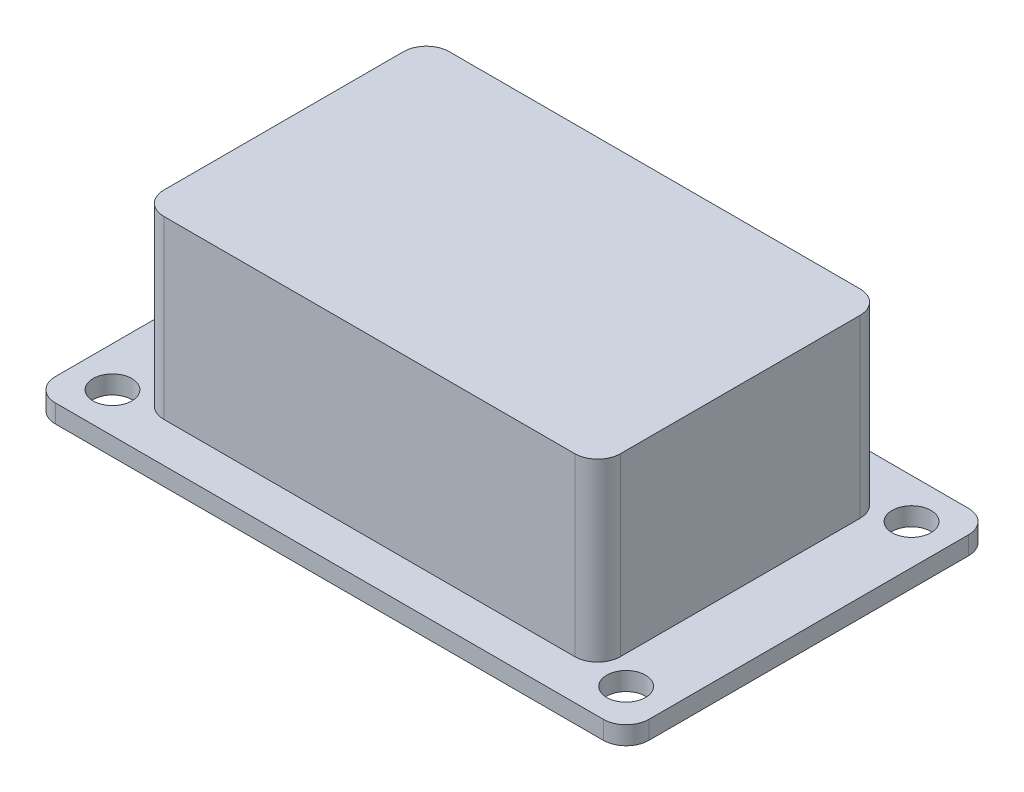
ISO-10303-21;
HEADER;
FILE_DESCRIPTION(('STEP AP214'),'2;1');
FILE_NAME('part.step','',(''),(''),'','','');
FILE_SCHEMA(('AUTOMOTIVE_DESIGN { 1 0 10303 214 1 1 1 1 }'));
ENDSEC;
DATA;
#1=APPLICATION_CONTEXT('core data for automotive mechanical design processes');
#2=APPLICATION_PROTOCOL_DEFINITION('international standard','automotive_design',2000,#1);
#3=PRODUCT_CONTEXT('',#1,'mechanical');
#4=PRODUCT('Part','Part','',(#3));
#5=PRODUCT_RELATED_PRODUCT_CATEGORY('part','',(#4));
#6=PRODUCT_DEFINITION_FORMATION('','',#4);
#7=PRODUCT_DEFINITION_CONTEXT('part definition',#1,'design');
#8=PRODUCT_DEFINITION('design','',#6,#7);
#9=PRODUCT_DEFINITION_SHAPE('','',#8);
#10=(LENGTH_UNIT() NAMED_UNIT(*) SI_UNIT(.MILLI.,.METRE.));
#11=(NAMED_UNIT(*) PLANE_ANGLE_UNIT() SI_UNIT($,.RADIAN.));
#12=(NAMED_UNIT(*) SI_UNIT($,.STERADIAN.) SOLID_ANGLE_UNIT());
#13=UNCERTAINTY_MEASURE_WITH_UNIT(LENGTH_MEASURE(1.E-05),#10,'distance_accuracy_value','');
#14=(GEOMETRIC_REPRESENTATION_CONTEXT(3) GLOBAL_UNCERTAINTY_ASSIGNED_CONTEXT((#13)) GLOBAL_UNIT_ASSIGNED_CONTEXT((#10,
#11,#12)) REPRESENTATION_CONTEXT('',''));
#15=CARTESIAN_POINT('',(0.,0.,0.));
#16=DIRECTION('',(0.,0.,1.));
#17=DIRECTION('',(1.,0.,0.));
#18=AXIS2_PLACEMENT_3D('',#15,#16,#17);
#19=CARTESIAN_POINT('',(-24.,1.6,14.));
#20=DIRECTION('',(0.,-1.,0.));
#21=DIRECTION('',(0.,0.,-1.));
#22=AXIS2_PLACEMENT_3D('',#19,#20,#21);
#23=CYLINDRICAL_SURFACE('',#22,2.);
#24=CARTESIAN_POINT('',(-24.,0.,14.));
#25=DIRECTION('',(0.,1.,0.));
#26=DIRECTION('',(0.,0.,1.));
#27=AXIS2_PLACEMENT_3D('',#24,#25,#26);
#28=CIRCLE('',#27,2.);
#29=CARTESIAN_POINT('',(-26.,0.,14.));
#30=VERTEX_POINT('',#29);
#31=CARTESIAN_POINT('',(-24.,0.,16.));
#32=VERTEX_POINT('',#31);
#33=EDGE_CURVE('E171',#30,#32,#28,.T.);
#34=ORIENTED_EDGE('',*,*,#33,.T.);
#35=DIRECTION('',(0.,-1.,0.));
#36=VECTOR('',#35,1.);
#37=CARTESIAN_POINT('',(-24.,1.6,16.));
#38=LINE('',#37,#36);
#39=CARTESIAN_POINT('',(-24.,1.6,16.));
#40=VERTEX_POINT('',#39);
#41=EDGE_CURVE('E11',#40,#32,#38,.T.);
#42=ORIENTED_EDGE('',*,*,#41,.F.);
#43=CARTESIAN_POINT('',(-24.,1.6,14.));
#44=DIRECTION('',(0.,1.,0.));
#45=DIRECTION('',(0.,0.,1.));
#46=AXIS2_PLACEMENT_3D('',#43,#44,#45);
#47=CIRCLE('',#46,2.);
#48=CARTESIAN_POINT('',(-26.,1.6,14.));
#49=VERTEX_POINT('',#48);
#50=EDGE_CURVE('E180',#49,#40,#47,.T.);
#51=ORIENTED_EDGE('',*,*,#50,.F.);
#52=DIRECTION('',(0.,-1.,0.));
#53=VECTOR('',#52,1.);
#54=CARTESIAN_POINT('',(-26.,1.6,14.));
#55=LINE('',#54,#53);
#56=EDGE_CURVE('E197',#49,#30,#55,.T.);
#57=ORIENTED_EDGE('',*,*,#56,.T.);
#58=EDGE_LOOP('',(#34,#42,#51,#57));
#59=FACE_BOUND('',#58,.T.);
#60=ADVANCED_FACE('F39',(#59),#23,.T.);
#61=CARTESIAN_POINT('',(-24.,1.6,16.));
#62=DIRECTION('',(0.,0.,-1.));
#63=DIRECTION('',(-1.,0.,0.));
#64=AXIS2_PLACEMENT_3D('',#61,#62,#63);
#65=PLANE('',#64);
#66=DIRECTION('',(1.,0.,0.));
#67=VECTOR('',#66,1.);
#68=CARTESIAN_POINT('',(-24.,0.,16.));
#69=LINE('',#68,#67);
#70=CARTESIAN_POINT('',(24.,0.,16.));
#71=VERTEX_POINT('',#70);
#72=EDGE_CURVE('E174',#32,#71,#69,.T.);
#73=ORIENTED_EDGE('',*,*,#72,.T.);
#74=DIRECTION('',(0.,-1.,0.));
#75=VECTOR('',#74,1.);
#76=CARTESIAN_POINT('',(24.,1.6,16.));
#77=LINE('',#76,#75);
#78=CARTESIAN_POINT('',(24.,1.6,16.));
#79=VERTEX_POINT('',#78);
#80=EDGE_CURVE('E46',#79,#71,#77,.T.);
#81=ORIENTED_EDGE('',*,*,#80,.F.);
#82=DIRECTION('',(1.,0.,0.));
#83=VECTOR('',#82,1.);
#84=CARTESIAN_POINT('',(-24.,1.6,16.));
#85=LINE('',#84,#83);
#86=EDGE_CURVE('E183',#40,#79,#85,.T.);
#87=ORIENTED_EDGE('',*,*,#86,.F.);
#88=ORIENTED_EDGE('',*,*,#41,.T.);
#89=EDGE_LOOP('',(#73,#81,#87,#88));
#90=FACE_BOUND('',#89,.T.);
#91=ADVANCED_FACE('F255',(#90),#65,.F.);
#92=CARTESIAN_POINT('',(24.,1.6,14.));
#93=DIRECTION('',(0.,-1.,0.));
#94=DIRECTION('',(0.,0.,-1.));
#95=AXIS2_PLACEMENT_3D('',#92,#93,#94);
#96=CYLINDRICAL_SURFACE('',#95,2.);
#97=CARTESIAN_POINT('',(24.,0.,14.));
#98=DIRECTION('',(0.,1.,0.));
#99=DIRECTION('',(0.,0.,1.));
#100=AXIS2_PLACEMENT_3D('',#97,#98,#99);
#101=CIRCLE('',#100,2.);
#102=CARTESIAN_POINT('',(26.,0.,14.));
#103=VERTEX_POINT('',#102);
#104=EDGE_CURVE('E200',#71,#103,#101,.T.);
#105=ORIENTED_EDGE('',*,*,#104,.T.);
#106=DIRECTION('',(0.,-1.,0.));
#107=VECTOR('',#106,1.);
#108=CARTESIAN_POINT('',(26.,1.6,14.));
#109=LINE('',#108,#107);
#110=CARTESIAN_POINT('',(26.,1.6,14.));
#111=VERTEX_POINT('',#110);
#112=EDGE_CURVE('E225',#111,#103,#109,.T.);
#113=ORIENTED_EDGE('',*,*,#112,.F.);
#114=CARTESIAN_POINT('',(24.,1.6,14.));
#115=DIRECTION('',(0.,1.,0.));
#116=DIRECTION('',(0.,0.,1.));
#117=AXIS2_PLACEMENT_3D('',#114,#115,#116);
#118=CIRCLE('',#117,2.);
#119=EDGE_CURVE('E186',#79,#111,#118,.T.);
#120=ORIENTED_EDGE('',*,*,#119,.F.);
#121=ORIENTED_EDGE('',*,*,#80,.T.);
#122=EDGE_LOOP('',(#105,#113,#120,#121));
#123=FACE_BOUND('',#122,.T.);
#124=ADVANCED_FACE('F232',(#123),#96,.T.);
#125=CARTESIAN_POINT('',(26.,1.6,14.));
#126=DIRECTION('',(-1.,0.,0.));
#127=DIRECTION('',(0.,0.,1.));
#128=AXIS2_PLACEMENT_3D('',#125,#126,#127);
#129=PLANE('',#128);
#130=DIRECTION('',(0.,0.,-1.));
#131=VECTOR('',#130,1.);
#132=CARTESIAN_POINT('',(26.,0.,14.));
#133=LINE('',#132,#131);
#134=CARTESIAN_POINT('',(26.,0.,-14.));
#135=VERTEX_POINT('',#134);
#136=EDGE_CURVE('E202',#103,#135,#133,.T.);
#137=ORIENTED_EDGE('',*,*,#136,.T.);
#138=DIRECTION('',(0.,-1.,0.));
#139=VECTOR('',#138,1.);
#140=CARTESIAN_POINT('',(26.,1.6,-14.));
#141=LINE('',#140,#139);
#142=CARTESIAN_POINT('',(26.,1.6,-14.));
#143=VERTEX_POINT('',#142);
#144=EDGE_CURVE('E222',#143,#135,#141,.T.);
#145=ORIENTED_EDGE('',*,*,#144,.F.);
#146=DIRECTION('',(0.,0.,-1.));
#147=VECTOR('',#146,1.);
#148=CARTESIAN_POINT('',(26.,1.6,14.));
#149=LINE('',#148,#147);
#150=EDGE_CURVE('E188',#111,#143,#149,.T.);
#151=ORIENTED_EDGE('',*,*,#150,.F.);
#152=ORIENTED_EDGE('',*,*,#112,.T.);
#153=EDGE_LOOP('',(#137,#145,#151,#152));
#154=FACE_BOUND('',#153,.T.);
#155=ADVANCED_FACE('F243',(#154),#129,.F.);
#156=CARTESIAN_POINT('',(24.,1.6,-14.));
#157=DIRECTION('',(0.,-1.,0.));
#158=DIRECTION('',(0.,0.,-1.));
#159=AXIS2_PLACEMENT_3D('',#156,#157,#158);
#160=CYLINDRICAL_SURFACE('',#159,2.);
#161=CARTESIAN_POINT('',(24.,0.,-14.));
#162=DIRECTION('',(0.,1.,0.));
#163=DIRECTION('',(0.,0.,1.));
#164=AXIS2_PLACEMENT_3D('',#161,#162,#163);
#165=CIRCLE('',#164,2.);
#166=CARTESIAN_POINT('',(24.,0.,-16.));
#167=VERTEX_POINT('',#166);
#168=EDGE_CURVE('E204',#135,#167,#165,.T.);
#169=ORIENTED_EDGE('',*,*,#168,.T.);
#170=DIRECTION('',(0.,-1.,0.));
#171=VECTOR('',#170,1.);
#172=CARTESIAN_POINT('',(24.,1.6,-16.));
#173=LINE('',#172,#171);
#174=CARTESIAN_POINT('',(24.,1.6,-16.));
#175=VERTEX_POINT('',#174);
#176=EDGE_CURVE('E219',#175,#167,#173,.T.);
#177=ORIENTED_EDGE('',*,*,#176,.F.);
#178=CARTESIAN_POINT('',(24.,1.6,-14.));
#179=DIRECTION('',(0.,1.,0.));
#180=DIRECTION('',(0.,0.,1.));
#181=AXIS2_PLACEMENT_3D('',#178,#179,#180);
#182=CIRCLE('',#181,2.);
#183=EDGE_CURVE('E190',#143,#175,#182,.T.);
#184=ORIENTED_EDGE('',*,*,#183,.F.);
#185=ORIENTED_EDGE('',*,*,#144,.T.);
#186=EDGE_LOOP('',(#169,#177,#184,#185));
#187=FACE_BOUND('',#186,.T.);
#188=ADVANCED_FACE('F247',(#187),#160,.T.);
#189=CARTESIAN_POINT('',(24.,1.6,-16.));
#190=DIRECTION('',(0.,0.,1.));
#191=DIRECTION('',(1.,0.,0.));
#192=AXIS2_PLACEMENT_3D('',#189,#190,#191);
#193=PLANE('',#192);
#194=DIRECTION('',(-1.,0.,0.));
#195=VECTOR('',#194,1.);
#196=CARTESIAN_POINT('',(24.,0.,-16.));
#197=LINE('',#196,#195);
#198=CARTESIAN_POINT('',(-24.,0.,-16.));
#199=VERTEX_POINT('',#198);
#200=EDGE_CURVE('E206',#167,#199,#197,.T.);
#201=ORIENTED_EDGE('',*,*,#200,.T.);
#202=DIRECTION('',(0.,-1.,0.));
#203=VECTOR('',#202,1.);
#204=CARTESIAN_POINT('',(-24.,1.6,-16.));
#205=LINE('',#204,#203);
#206=CARTESIAN_POINT('',(-24.,1.6,-16.));
#207=VERTEX_POINT('',#206);
#208=EDGE_CURVE('E216',#207,#199,#205,.T.);
#209=ORIENTED_EDGE('',*,*,#208,.F.);
#210=DIRECTION('',(-1.,0.,0.));
#211=VECTOR('',#210,1.);
#212=CARTESIAN_POINT('',(24.,1.6,-16.));
#213=LINE('',#212,#211);
#214=EDGE_CURVE('E192',#175,#207,#213,.T.);
#215=ORIENTED_EDGE('',*,*,#214,.F.);
#216=ORIENTED_EDGE('',*,*,#176,.T.);
#217=EDGE_LOOP('',(#201,#209,#215,#216));
#218=FACE_BOUND('',#217,.T.);
#219=ADVANCED_FACE('F268',(#218),#193,.F.);
#220=CARTESIAN_POINT('',(-24.,1.6,-14.));
#221=DIRECTION('',(0.,-1.,0.));
#222=DIRECTION('',(0.,0.,-1.));
#223=AXIS2_PLACEMENT_3D('',#220,#221,#222);
#224=CYLINDRICAL_SURFACE('',#223,2.);
#225=CARTESIAN_POINT('',(-24.,0.,-14.));
#226=DIRECTION('',(0.,1.,0.));
#227=DIRECTION('',(0.,0.,1.));
#228=AXIS2_PLACEMENT_3D('',#225,#226,#227);
#229=CIRCLE('',#228,2.);
#230=CARTESIAN_POINT('',(-26.,0.,-14.));
#231=VERTEX_POINT('',#230);
#232=EDGE_CURVE('E208',#199,#231,#229,.T.);
#233=ORIENTED_EDGE('',*,*,#232,.T.);
#234=DIRECTION('',(0.,-1.,0.));
#235=VECTOR('',#234,1.);
#236=CARTESIAN_POINT('',(-26.,1.6,-14.));
#237=LINE('',#236,#235);
#238=CARTESIAN_POINT('',(-26.,1.6,-14.));
#239=VERTEX_POINT('',#238);
#240=EDGE_CURVE('E213',#239,#231,#237,.T.);
#241=ORIENTED_EDGE('',*,*,#240,.F.);
#242=CARTESIAN_POINT('',(-24.,1.6,-14.));
#243=DIRECTION('',(0.,1.,0.));
#244=DIRECTION('',(0.,0.,1.));
#245=AXIS2_PLACEMENT_3D('',#242,#243,#244);
#246=CIRCLE('',#245,2.);
#247=EDGE_CURVE('E194',#207,#239,#246,.T.);
#248=ORIENTED_EDGE('',*,*,#247,.F.);
#249=ORIENTED_EDGE('',*,*,#208,.T.);
#250=EDGE_LOOP('',(#233,#241,#248,#249));
#251=FACE_BOUND('',#250,.T.);
#252=ADVANCED_FACE('F266',(#251),#224,.T.);
#253=CARTESIAN_POINT('',(-26.,1.6,-14.));
#254=DIRECTION('',(1.,0.,0.));
#255=DIRECTION('',(0.,0.,-1.));
#256=AXIS2_PLACEMENT_3D('',#253,#254,#255);
#257=PLANE('',#256);
#258=DIRECTION('',(0.,0.,1.));
#259=VECTOR('',#258,1.);
#260=CARTESIAN_POINT('',(-26.,0.,-14.));
#261=LINE('',#260,#259);
#262=EDGE_CURVE('E184',#231,#30,#261,.T.);
#263=ORIENTED_EDGE('',*,*,#262,.T.);
#264=ORIENTED_EDGE('',*,*,#56,.F.);
#265=DIRECTION('',(0.,0.,1.));
#266=VECTOR('',#265,1.);
#267=CARTESIAN_POINT('',(-26.,1.6,-14.));
#268=LINE('',#267,#266);
#269=EDGE_CURVE('E196',#239,#49,#268,.T.);
#270=ORIENTED_EDGE('',*,*,#269,.F.);
#271=ORIENTED_EDGE('',*,*,#240,.T.);
#272=EDGE_LOOP('',(#263,#264,#270,#271));
#273=FACE_BOUND('',#272,.T.);
#274=ADVANCED_FACE('F261',(#273),#257,.F.);
#275=CARTESIAN_POINT('',(-24.,1.6,14.));
#276=DIRECTION('',(0.,1.,0.));
#277=DIRECTION('',(0.,0.,1.));
#278=AXIS2_PLACEMENT_3D('',#275,#276,#277);
#279=PLANE('',#278);
#280=CARTESIAN_POINT('',(22.5,1.6,-12.5));
#281=DIRECTION('',(0.,1.,0.));
#282=DIRECTION('',(0.,0.,1.));
#283=AXIS2_PLACEMENT_3D('',#280,#281,#282);
#284=CIRCLE('',#283,1.7);
#285=CARTESIAN_POINT('',(22.5,1.6,-10.8));
#286=VERTEX_POINT('',#285);
#287=EDGE_CURVE('E463',#286,#286,#284,.T.);
#288=ORIENTED_EDGE('',*,*,#287,.F.);
#289=EDGE_LOOP('',(#288));
#290=FACE_BOUND('',#289,.T.);
#291=CARTESIAN_POINT('',(-22.5,1.6,12.5));
#292=DIRECTION('',(0.,1.,0.));
#293=DIRECTION('',(0.,0.,1.));
#294=AXIS2_PLACEMENT_3D('',#291,#292,#293);
#295=CIRCLE('',#294,1.7);
#296=CARTESIAN_POINT('',(-22.5,1.6,14.2));
#297=VERTEX_POINT('',#296);
#298=EDGE_CURVE('E480',#297,#297,#295,.T.);
#299=ORIENTED_EDGE('',*,*,#298,.F.);
#300=EDGE_LOOP('',(#299));
#301=FACE_BOUND('',#300,.T.);
#302=CARTESIAN_POINT('',(-22.5,1.6,-12.5));
#303=DIRECTION('',(0.,1.,0.));
#304=DIRECTION('',(0.,0.,1.));
#305=AXIS2_PLACEMENT_3D('',#302,#303,#304);
#306=CIRCLE('',#305,1.7);
#307=CARTESIAN_POINT('',(-22.5,1.6,-10.8));
#308=VERTEX_POINT('',#307);
#309=EDGE_CURVE('E475',#308,#308,#306,.T.);
#310=ORIENTED_EDGE('',*,*,#309,.F.);
#311=EDGE_LOOP('',(#310));
#312=FACE_BOUND('',#311,.T.);
#313=CARTESIAN_POINT('',(22.5,1.6,12.5));
#314=DIRECTION('',(0.,1.,0.));
#315=DIRECTION('',(0.,0.,1.));
#316=AXIS2_PLACEMENT_3D('',#313,#314,#315);
#317=CIRCLE('',#316,1.7);
#318=CARTESIAN_POINT('',(22.5,1.6,14.2));
#319=VERTEX_POINT('',#318);
#320=EDGE_CURVE('E470',#319,#319,#317,.T.);
#321=ORIENTED_EDGE('',*,*,#320,.F.);
#322=EDGE_LOOP('',(#321));
#323=FACE_BOUND('',#322,.T.);
#324=CARTESIAN_POINT('',(-18.,1.6,10.5));
#325=DIRECTION('',(0.,1.,0.));
#326=DIRECTION('',(0.,0.,1.));
#327=AXIS2_PLACEMENT_3D('',#324,#325,#326);
#328=CIRCLE('',#327,2.);
#329=CARTESIAN_POINT('',(-20.,1.6,10.5));
#330=VERTEX_POINT('',#329);
#331=CARTESIAN_POINT('',(-18.,1.6,12.5));
#332=VERTEX_POINT('',#331);
#333=EDGE_CURVE('E53',#330,#332,#328,.T.);
#334=ORIENTED_EDGE('',*,*,#333,.F.);
#335=DIRECTION('',(0.,0.,1.));
#336=VECTOR('',#335,1.);
#337=CARTESIAN_POINT('',(-20.,1.6,-10.5));
#338=LINE('',#337,#336);
#339=CARTESIAN_POINT('',(-20.,1.6,-10.5));
#340=VERTEX_POINT('',#339);
#341=EDGE_CURVE('E57',#340,#330,#338,.T.);
#342=ORIENTED_EDGE('',*,*,#341,.F.);
#343=CARTESIAN_POINT('',(-18.,1.6,-10.5));
#344=DIRECTION('',(0.,1.,0.));
#345=DIRECTION('',(0.,0.,1.));
#346=AXIS2_PLACEMENT_3D('',#343,#344,#345);
#347=CIRCLE('',#346,2.);
#348=CARTESIAN_POINT('',(-18.,1.6,-12.5));
#349=VERTEX_POINT('',#348);
#350=EDGE_CURVE('E512',#349,#340,#347,.T.);
#351=ORIENTED_EDGE('',*,*,#350,.F.);
#352=DIRECTION('',(-1.,0.,0.));
#353=VECTOR('',#352,1.);
#354=CARTESIAN_POINT('',(18.,1.6,-12.5));
#355=LINE('',#354,#353);
#356=CARTESIAN_POINT('',(18.,1.6,-12.5));
#357=VERTEX_POINT('',#356);
#358=EDGE_CURVE('E509',#357,#349,#355,.T.);
#359=ORIENTED_EDGE('',*,*,#358,.F.);
#360=CARTESIAN_POINT('',(18.,1.6,-10.5));
#361=DIRECTION('',(0.,1.,0.));
#362=DIRECTION('',(0.,0.,1.));
#363=AXIS2_PLACEMENT_3D('',#360,#361,#362);
#364=CIRCLE('',#363,2.);
#365=CARTESIAN_POINT('',(20.,1.6,-10.5));
#366=VERTEX_POINT('',#365);
#367=EDGE_CURVE('E506',#366,#357,#364,.T.);
#368=ORIENTED_EDGE('',*,*,#367,.F.);
#369=DIRECTION('',(0.,0.,-1.));
#370=VECTOR('',#369,1.);
#371=CARTESIAN_POINT('',(20.,1.6,10.5));
#372=LINE('',#371,#370);
#373=CARTESIAN_POINT('',(20.,1.6,10.5));
#374=VERTEX_POINT('',#373);
#375=EDGE_CURVE('E503',#374,#366,#372,.T.);
#376=ORIENTED_EDGE('',*,*,#375,.F.);
#377=CARTESIAN_POINT('',(18.,1.6,10.5));
#378=DIRECTION('',(0.,1.,0.));
#379=DIRECTION('',(0.,0.,1.));
#380=AXIS2_PLACEMENT_3D('',#377,#378,#379);
#381=CIRCLE('',#380,2.);
#382=CARTESIAN_POINT('',(18.,1.6,12.5));
#383=VERTEX_POINT('',#382);
#384=EDGE_CURVE('E500',#383,#374,#381,.T.);
#385=ORIENTED_EDGE('',*,*,#384,.F.);
#386=DIRECTION('',(1.,0.,0.));
#387=VECTOR('',#386,1.);
#388=CARTESIAN_POINT('',(-18.,1.6,12.5));
#389=LINE('',#388,#387);
#390=EDGE_CURVE('E498',#332,#383,#389,.T.);
#391=ORIENTED_EDGE('',*,*,#390,.F.);
#392=EDGE_LOOP('',(#334,#342,#351,#359,#368,#376,#385,#391));
#393=FACE_BOUND('',#392,.T.);
#394=ORIENTED_EDGE('',*,*,#50,.T.);
#395=ORIENTED_EDGE('',*,*,#86,.T.);
#396=ORIENTED_EDGE('',*,*,#119,.T.);
#397=ORIENTED_EDGE('',*,*,#150,.T.);
#398=ORIENTED_EDGE('',*,*,#183,.T.);
#399=ORIENTED_EDGE('',*,*,#214,.T.);
#400=ORIENTED_EDGE('',*,*,#247,.T.);
#401=ORIENTED_EDGE('',*,*,#269,.T.);
#402=EDGE_LOOP('',(#394,#395,#396,#397,#398,#399,#400,#401));
#403=FACE_BOUND('',#402,.T.);
#404=ADVANCED_FACE('F251',(#290,#301,#312,#323,#393,#403),#279,.T.);
#405=CARTESIAN_POINT('',(-24.,0.,14.));
#406=DIRECTION('',(0.,1.,0.));
#407=DIRECTION('',(0.,0.,1.));
#408=AXIS2_PLACEMENT_3D('',#405,#406,#407);
#409=PLANE('',#408);
#410=CARTESIAN_POINT('',(22.5,0.,-12.5));
#411=DIRECTION('',(0.,1.,0.));
#412=DIRECTION('',(0.,0.,1.));
#413=AXIS2_PLACEMENT_3D('',#410,#411,#412);
#414=CIRCLE('',#413,1.7);
#415=CARTESIAN_POINT('',(22.5,0.,-10.8));
#416=VERTEX_POINT('',#415);
#417=EDGE_CURVE('E466',#416,#416,#414,.T.);
#418=ORIENTED_EDGE('',*,*,#417,.T.);
#419=EDGE_LOOP('',(#418));
#420=FACE_BOUND('',#419,.T.);
#421=CARTESIAN_POINT('',(-22.5,0.,12.5));
#422=DIRECTION('',(0.,1.,0.));
#423=DIRECTION('',(0.,0.,1.));
#424=AXIS2_PLACEMENT_3D('',#421,#422,#423);
#425=CIRCLE('',#424,1.7);
#426=CARTESIAN_POINT('',(-22.5,0.,14.2));
#427=VERTEX_POINT('',#426);
#428=EDGE_CURVE('E472',#427,#427,#425,.T.);
#429=ORIENTED_EDGE('',*,*,#428,.T.);
#430=EDGE_LOOP('',(#429));
#431=FACE_BOUND('',#430,.T.);
#432=CARTESIAN_POINT('',(-22.5,0.,-12.5));
#433=DIRECTION('',(0.,1.,0.));
#434=DIRECTION('',(0.,0.,1.));
#435=AXIS2_PLACEMENT_3D('',#432,#433,#434);
#436=CIRCLE('',#435,1.7);
#437=CARTESIAN_POINT('',(-22.5,0.,-10.8));
#438=VERTEX_POINT('',#437);
#439=EDGE_CURVE('E483',#438,#438,#436,.T.);
#440=ORIENTED_EDGE('',*,*,#439,.T.);
#441=EDGE_LOOP('',(#440));
#442=FACE_BOUND('',#441,.T.);
#443=CARTESIAN_POINT('',(22.5,0.,12.5));
#444=DIRECTION('',(0.,1.,0.));
#445=DIRECTION('',(0.,0.,1.));
#446=AXIS2_PLACEMENT_3D('',#443,#444,#445);
#447=CIRCLE('',#446,1.7);
#448=CARTESIAN_POINT('',(22.5,0.,14.2));
#449=VERTEX_POINT('',#448);
#450=EDGE_CURVE('E467',#449,#449,#447,.T.);
#451=ORIENTED_EDGE('',*,*,#450,.T.);
#452=EDGE_LOOP('',(#451));
#453=FACE_BOUND('',#452,.T.);
#454=ORIENTED_EDGE('',*,*,#33,.F.);
#455=ORIENTED_EDGE('',*,*,#262,.F.);
#456=ORIENTED_EDGE('',*,*,#232,.F.);
#457=ORIENTED_EDGE('',*,*,#200,.F.);
#458=ORIENTED_EDGE('',*,*,#168,.F.);
#459=ORIENTED_EDGE('',*,*,#136,.F.);
#460=ORIENTED_EDGE('',*,*,#104,.F.);
#461=ORIENTED_EDGE('',*,*,#72,.F.);
#462=EDGE_LOOP('',(#454,#455,#456,#457,#458,#459,#460,#461));
#463=FACE_BOUND('',#462,.T.);
#464=ADVANCED_FACE('F238',(#420,#431,#442,#453,#463),#409,.F.);
#465=CARTESIAN_POINT('',(-18.,17.,10.5));
#466=DIRECTION('',(0.,-1.,0.));
#467=DIRECTION('',(0.,0.,-1.));
#468=AXIS2_PLACEMENT_3D('',#465,#466,#467);
#469=CYLINDRICAL_SURFACE('',#468,2.);
#470=ORIENTED_EDGE('',*,*,#333,.T.);
#471=DIRECTION('',(0.,-1.,0.));
#472=VECTOR('',#471,1.);
#473=CARTESIAN_POINT('',(-18.,17.,12.5));
#474=LINE('',#473,#472);
#475=CARTESIAN_POINT('',(-18.,17.,12.5));
#476=VERTEX_POINT('',#475);
#477=EDGE_CURVE('E154',#476,#332,#474,.T.);
#478=ORIENTED_EDGE('',*,*,#477,.F.);
#479=CARTESIAN_POINT('',(-18.,17.,10.5));
#480=DIRECTION('',(0.,1.,0.));
#481=DIRECTION('',(0.,0.,1.));
#482=AXIS2_PLACEMENT_3D('',#479,#480,#481);
#483=CIRCLE('',#482,2.);
#484=CARTESIAN_POINT('',(-20.,17.,10.5));
#485=VERTEX_POINT('',#484);
#486=EDGE_CURVE('E160',#485,#476,#483,.T.);
#487=ORIENTED_EDGE('',*,*,#486,.F.);
#488=DIRECTION('',(0.,-1.,0.));
#489=VECTOR('',#488,1.);
#490=CARTESIAN_POINT('',(-20.,17.,10.5));
#491=LINE('',#490,#489);
#492=EDGE_CURVE('E496',#485,#330,#491,.T.);
#493=ORIENTED_EDGE('',*,*,#492,.T.);
#494=EDGE_LOOP('',(#470,#478,#487,#493));
#495=FACE_BOUND('',#494,.T.);
#496=ADVANCED_FACE('F170',(#495),#469,.T.);
#497=CARTESIAN_POINT('',(-18.,17.,12.5));
#498=DIRECTION('',(0.,0.,-1.));
#499=DIRECTION('',(-1.,0.,0.));
#500=AXIS2_PLACEMENT_3D('',#497,#498,#499);
#501=PLANE('',#500);
#502=ORIENTED_EDGE('',*,*,#390,.T.);
#503=DIRECTION('',(0.,-1.,0.));
#504=VECTOR('',#503,1.);
#505=CARTESIAN_POINT('',(18.,17.,12.5));
#506=LINE('',#505,#504);
#507=CARTESIAN_POINT('',(18.,17.,12.5));
#508=VERTEX_POINT('',#507);
#509=EDGE_CURVE('E156',#508,#383,#506,.T.);
#510=ORIENTED_EDGE('',*,*,#509,.F.);
#511=DIRECTION('',(1.,0.,0.));
#512=VECTOR('',#511,1.);
#513=CARTESIAN_POINT('',(-18.,17.,12.5));
#514=LINE('',#513,#512);
#515=EDGE_CURVE('E149',#476,#508,#514,.T.);
#516=ORIENTED_EDGE('',*,*,#515,.F.);
#517=ORIENTED_EDGE('',*,*,#477,.T.);
#518=EDGE_LOOP('',(#502,#510,#516,#517));
#519=FACE_BOUND('',#518,.T.);
#520=ADVANCED_FACE('F152',(#519),#501,.F.);
#521=CARTESIAN_POINT('',(18.,17.,10.5));
#522=DIRECTION('',(0.,-1.,0.));
#523=DIRECTION('',(0.,0.,-1.));
#524=AXIS2_PLACEMENT_3D('',#521,#522,#523);
#525=CYLINDRICAL_SURFACE('',#524,2.);
#526=ORIENTED_EDGE('',*,*,#384,.T.);
#527=DIRECTION('',(0.,-1.,0.));
#528=VECTOR('',#527,1.);
#529=CARTESIAN_POINT('',(20.,17.,10.5));
#530=LINE('',#529,#528);
#531=CARTESIAN_POINT('',(20.,17.,10.5));
#532=VERTEX_POINT('',#531);
#533=EDGE_CURVE('E176',#532,#374,#530,.T.);
#534=ORIENTED_EDGE('',*,*,#533,.F.);
#535=CARTESIAN_POINT('',(18.,17.,10.5));
#536=DIRECTION('',(0.,1.,0.));
#537=DIRECTION('',(0.,0.,1.));
#538=AXIS2_PLACEMENT_3D('',#535,#536,#537);
#539=CIRCLE('',#538,2.);
#540=EDGE_CURVE('E159',#508,#532,#539,.T.);
#541=ORIENTED_EDGE('',*,*,#540,.F.);
#542=ORIENTED_EDGE('',*,*,#509,.T.);
#543=EDGE_LOOP('',(#526,#534,#541,#542));
#544=FACE_BOUND('',#543,.T.);
#545=ADVANCED_FACE('F352',(#544),#525,.T.);
#546=CARTESIAN_POINT('',(20.,17.,10.5));
#547=DIRECTION('',(-1.,0.,0.));
#548=DIRECTION('',(0.,0.,1.));
#549=AXIS2_PLACEMENT_3D('',#546,#547,#548);
#550=PLANE('',#549);
#551=ORIENTED_EDGE('',*,*,#375,.T.);
#552=DIRECTION('',(0.,-1.,0.));
#553=VECTOR('',#552,1.);
#554=CARTESIAN_POINT('',(20.,17.,-10.5));
#555=LINE('',#554,#553);
#556=CARTESIAN_POINT('',(20.,17.,-10.5));
#557=VERTEX_POINT('',#556);
#558=EDGE_CURVE('E525',#557,#366,#555,.T.);
#559=ORIENTED_EDGE('',*,*,#558,.F.);
#560=DIRECTION('',(0.,0.,-1.));
#561=VECTOR('',#560,1.);
#562=CARTESIAN_POINT('',(20.,17.,10.5));
#563=LINE('',#562,#561);
#564=EDGE_CURVE('E487',#532,#557,#563,.T.);
#565=ORIENTED_EDGE('',*,*,#564,.F.);
#566=ORIENTED_EDGE('',*,*,#533,.T.);
#567=EDGE_LOOP('',(#551,#559,#565,#566));
#568=FACE_BOUND('',#567,.T.);
#569=ADVANCED_FACE('F361',(#568),#550,.F.);
#570=CARTESIAN_POINT('',(18.,17.,-10.5));
#571=DIRECTION('',(0.,-1.,0.));
#572=DIRECTION('',(0.,0.,-1.));
#573=AXIS2_PLACEMENT_3D('',#570,#571,#572);
#574=CYLINDRICAL_SURFACE('',#573,2.);
#575=ORIENTED_EDGE('',*,*,#367,.T.);
#576=DIRECTION('',(0.,-1.,0.));
#577=VECTOR('',#576,1.);
#578=CARTESIAN_POINT('',(18.,17.,-12.5));
#579=LINE('',#578,#577);
#580=CARTESIAN_POINT('',(18.,17.,-12.5));
#581=VERTEX_POINT('',#580);
#582=EDGE_CURVE('E522',#581,#357,#579,.T.);
#583=ORIENTED_EDGE('',*,*,#582,.F.);
#584=CARTESIAN_POINT('',(18.,17.,-10.5));
#585=DIRECTION('',(0.,1.,0.));
#586=DIRECTION('',(0.,0.,1.));
#587=AXIS2_PLACEMENT_3D('',#584,#585,#586);
#588=CIRCLE('',#587,2.);
#589=EDGE_CURVE('E489',#557,#581,#588,.T.);
#590=ORIENTED_EDGE('',*,*,#589,.F.);
#591=ORIENTED_EDGE('',*,*,#558,.T.);
#592=EDGE_LOOP('',(#575,#583,#590,#591));
#593=FACE_BOUND('',#592,.T.);
#594=ADVANCED_FACE('F371',(#593),#574,.T.);
#595=CARTESIAN_POINT('',(18.,17.,-12.5));
#596=DIRECTION('',(0.,0.,1.));
#597=DIRECTION('',(1.,0.,0.));
#598=AXIS2_PLACEMENT_3D('',#595,#596,#597);
#599=PLANE('',#598);
#600=ORIENTED_EDGE('',*,*,#358,.T.);
#601=DIRECTION('',(0.,-1.,0.));
#602=VECTOR('',#601,1.);
#603=CARTESIAN_POINT('',(-18.,17.,-12.5));
#604=LINE('',#603,#602);
#605=CARTESIAN_POINT('',(-18.,17.,-12.5));
#606=VERTEX_POINT('',#605);
#607=EDGE_CURVE('E519',#606,#349,#604,.T.);
#608=ORIENTED_EDGE('',*,*,#607,.F.);
#609=DIRECTION('',(-1.,0.,0.));
#610=VECTOR('',#609,1.);
#611=CARTESIAN_POINT('',(18.,17.,-12.5));
#612=LINE('',#611,#610);
#613=EDGE_CURVE('E491',#581,#606,#612,.T.);
#614=ORIENTED_EDGE('',*,*,#613,.F.);
#615=ORIENTED_EDGE('',*,*,#582,.T.);
#616=EDGE_LOOP('',(#600,#608,#614,#615));
#617=FACE_BOUND('',#616,.T.);
#618=ADVANCED_FACE('F381',(#617),#599,.F.);
#619=CARTESIAN_POINT('',(-18.,17.,-10.5));
#620=DIRECTION('',(0.,-1.,0.));
#621=DIRECTION('',(0.,0.,-1.));
#622=AXIS2_PLACEMENT_3D('',#619,#620,#621);
#623=CYLINDRICAL_SURFACE('',#622,2.);
#624=ORIENTED_EDGE('',*,*,#350,.T.);
#625=DIRECTION('',(0.,-1.,0.));
#626=VECTOR('',#625,1.);
#627=CARTESIAN_POINT('',(-20.,17.,-10.5));
#628=LINE('',#627,#626);
#629=CARTESIAN_POINT('',(-20.,17.,-10.5));
#630=VERTEX_POINT('',#629);
#631=EDGE_CURVE('E516',#630,#340,#628,.T.);
#632=ORIENTED_EDGE('',*,*,#631,.F.);
#633=CARTESIAN_POINT('',(-18.,17.,-10.5));
#634=DIRECTION('',(0.,1.,0.));
#635=DIRECTION('',(0.,0.,1.));
#636=AXIS2_PLACEMENT_3D('',#633,#634,#635);
#637=CIRCLE('',#636,2.);
#638=EDGE_CURVE('E493',#606,#630,#637,.T.);
#639=ORIENTED_EDGE('',*,*,#638,.F.);
#640=ORIENTED_EDGE('',*,*,#607,.T.);
#641=EDGE_LOOP('',(#624,#632,#639,#640));
#642=FACE_BOUND('',#641,.T.);
#643=ADVANCED_FACE('F391',(#642),#623,.T.);
#644=CARTESIAN_POINT('',(-20.,17.,-10.5));
#645=DIRECTION('',(1.,0.,0.));
#646=DIRECTION('',(0.,0.,-1.));
#647=AXIS2_PLACEMENT_3D('',#644,#645,#646);
#648=PLANE('',#647);
#649=ORIENTED_EDGE('',*,*,#341,.T.);
#650=ORIENTED_EDGE('',*,*,#492,.F.);
#651=DIRECTION('',(0.,0.,1.));
#652=VECTOR('',#651,1.);
#653=CARTESIAN_POINT('',(-20.,17.,-10.5));
#654=LINE('',#653,#652);
#655=EDGE_CURVE('E165',#630,#485,#654,.T.);
#656=ORIENTED_EDGE('',*,*,#655,.F.);
#657=ORIENTED_EDGE('',*,*,#631,.T.);
#658=EDGE_LOOP('',(#649,#650,#656,#657));
#659=FACE_BOUND('',#658,.T.);
#660=ADVANCED_FACE('F401',(#659),#648,.F.);
#661=CARTESIAN_POINT('',(-18.,17.,10.5));
#662=DIRECTION('',(0.,1.,0.));
#663=DIRECTION('',(0.,0.,1.));
#664=AXIS2_PLACEMENT_3D('',#661,#662,#663);
#665=PLANE('',#664);
#666=ORIENTED_EDGE('',*,*,#486,.T.);
#667=ORIENTED_EDGE('',*,*,#515,.T.);
#668=ORIENTED_EDGE('',*,*,#540,.T.);
#669=ORIENTED_EDGE('',*,*,#564,.T.);
#670=ORIENTED_EDGE('',*,*,#589,.T.);
#671=ORIENTED_EDGE('',*,*,#613,.T.);
#672=ORIENTED_EDGE('',*,*,#638,.T.);
#673=ORIENTED_EDGE('',*,*,#655,.T.);
#674=EDGE_LOOP('',(#666,#667,#668,#669,#670,#671,#672,#673));
#675=FACE_BOUND('',#674,.T.);
#676=ADVANCED_FACE('F163',(#675),#665,.T.);
#677=CARTESIAN_POINT('',(22.5,1.6,12.5));
#678=DIRECTION('',(0.,-1.,0.));
#679=DIRECTION('',(0.,0.,-1.));
#680=AXIS2_PLACEMENT_3D('',#677,#678,#679);
#681=CYLINDRICAL_SURFACE('',#680,1.7);
#682=ORIENTED_EDGE('',*,*,#320,.T.);
#683=EDGE_LOOP('',(#682));
#684=FACE_BOUND('',#683,.T.);
#685=ORIENTED_EDGE('',*,*,#450,.F.);
#686=EDGE_LOOP('',(#685));
#687=FACE_BOUND('',#686,.T.);
#688=ADVANCED_FACE('F419',(#684,#687),#681,.F.);
#689=CARTESIAN_POINT('',(-22.5,1.6,-12.5));
#690=DIRECTION('',(0.,-1.,0.));
#691=DIRECTION('',(0.,0.,-1.));
#692=AXIS2_PLACEMENT_3D('',#689,#690,#691);
#693=CYLINDRICAL_SURFACE('',#692,1.7);
#694=ORIENTED_EDGE('',*,*,#309,.T.);
#695=EDGE_LOOP('',(#694));
#696=FACE_BOUND('',#695,.T.);
#697=ORIENTED_EDGE('',*,*,#439,.F.);
#698=EDGE_LOOP('',(#697));
#699=FACE_BOUND('',#698,.T.);
#700=ADVANCED_FACE('F427',(#696,#699),#693,.F.);
#701=CARTESIAN_POINT('',(-22.5,1.6,12.5));
#702=DIRECTION('',(0.,-1.,0.));
#703=DIRECTION('',(0.,0.,-1.));
#704=AXIS2_PLACEMENT_3D('',#701,#702,#703);
#705=CYLINDRICAL_SURFACE('',#704,1.7);
#706=ORIENTED_EDGE('',*,*,#298,.T.);
#707=EDGE_LOOP('',(#706));
#708=FACE_BOUND('',#707,.T.);
#709=ORIENTED_EDGE('',*,*,#428,.F.);
#710=EDGE_LOOP('',(#709));
#711=FACE_BOUND('',#710,.T.);
#712=ADVANCED_FACE('F437',(#708,#711),#705,.F.);
#713=CARTESIAN_POINT('',(22.5,1.6,-12.5));
#714=DIRECTION('',(0.,-1.,0.));
#715=DIRECTION('',(0.,0.,-1.));
#716=AXIS2_PLACEMENT_3D('',#713,#714,#715);
#717=CYLINDRICAL_SURFACE('',#716,1.7);
#718=ORIENTED_EDGE('',*,*,#287,.T.);
#719=EDGE_LOOP('',(#718));
#720=FACE_BOUND('',#719,.T.);
#721=ORIENTED_EDGE('',*,*,#417,.F.);
#722=EDGE_LOOP('',(#721));
#723=FACE_BOUND('',#722,.T.);
#724=ADVANCED_FACE('F447',(#720,#723),#717,.F.);
#725=CLOSED_SHELL('',(#60,#91,#124,#155,#188,#219,#252,#274,#404,#464,#496,#520,#545,#569,#594,
#618,#643,#660,#676,#688,#700,#712,#724));
#726=MANIFOLD_SOLID_BREP('B2',#725);
#727=ADVANCED_BREP_SHAPE_REPRESENTATION('',(#18,#726),#14);
#728=SHAPE_DEFINITION_REPRESENTATION(#9,#727);
ENDSEC;
END-ISO-10303-21;
